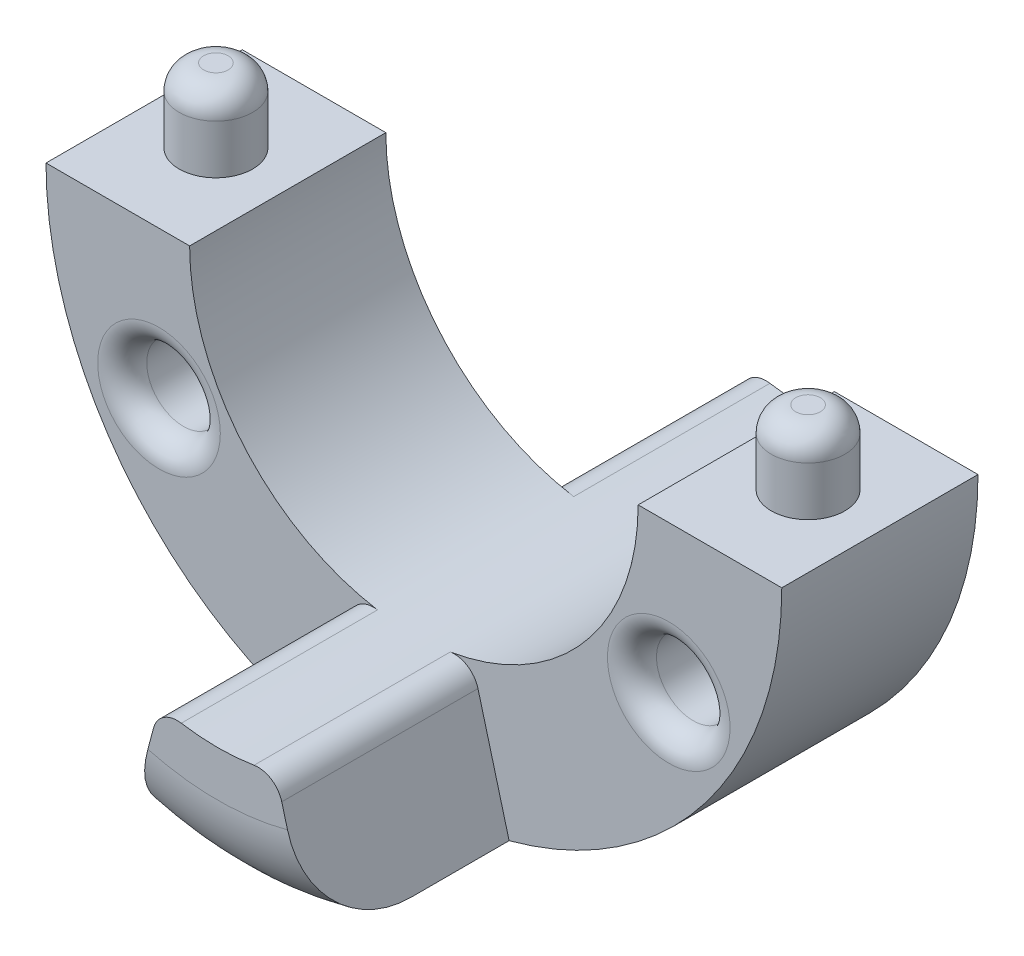
ISO-10303-21;
HEADER;
FILE_DESCRIPTION(('STEP AP214'),'2;1');
FILE_NAME('part.step','',(''),(''),'','','');
FILE_SCHEMA(('AUTOMOTIVE_DESIGN { 1 0 10303 214 1 1 1 1 }'));
ENDSEC;
DATA;
#1=APPLICATION_CONTEXT('core data for automotive mechanical design processes');
#2=APPLICATION_PROTOCOL_DEFINITION('international standard','automotive_design',2000,#1);
#3=PRODUCT_CONTEXT('',#1,'mechanical');
#4=PRODUCT('Part','Part','',(#3));
#5=PRODUCT_RELATED_PRODUCT_CATEGORY('part','',(#4));
#6=PRODUCT_DEFINITION_FORMATION('','',#4);
#7=PRODUCT_DEFINITION_CONTEXT('part definition',#1,'design');
#8=PRODUCT_DEFINITION('design','',#6,#7);
#9=PRODUCT_DEFINITION_SHAPE('','',#8);
#10=(LENGTH_UNIT() NAMED_UNIT(*) SI_UNIT(.MILLI.,.METRE.));
#11=(NAMED_UNIT(*) PLANE_ANGLE_UNIT() SI_UNIT($,.RADIAN.));
#12=(NAMED_UNIT(*) SI_UNIT($,.STERADIAN.) SOLID_ANGLE_UNIT());
#13=UNCERTAINTY_MEASURE_WITH_UNIT(LENGTH_MEASURE(1.E-05),#10,'distance_accuracy_value','');
#14=(GEOMETRIC_REPRESENTATION_CONTEXT(3) GLOBAL_UNCERTAINTY_ASSIGNED_CONTEXT((#13)) GLOBAL_UNIT_ASSIGNED_CONTEXT((#10,
#11,#12)) REPRESENTATION_CONTEXT('',''));
#15=CARTESIAN_POINT('',(0.,0.,0.));
#16=DIRECTION('',(0.,0.,1.));
#17=DIRECTION('',(1.,0.,0.));
#18=AXIS2_PLACEMENT_3D('',#15,#16,#17);
#19=CARTESIAN_POINT('',(-3.75,0.,-2.));
#20=DIRECTION('',(0.,-1.,0.));
#21=DIRECTION('',(1.,0.,0.));
#22=AXIS2_PLACEMENT_3D('',#19,#20,#21);
#23=PLANE('',#22);
#24=DIRECTION('',(1.,0.,0.));
#25=VECTOR('',#24,1.);
#26=CARTESIAN_POINT('',(0.,0.,2.));
#27=LINE('',#26,#25);
#28=CARTESIAN_POINT('',(2.286,0.,2.));
#29=VERTEX_POINT('',#28);
#30=CARTESIAN_POINT('',(3.75,0.,2.));
#31=VERTEX_POINT('',#30);
#32=EDGE_CURVE('E161',#29,#31,#27,.T.);
#33=ORIENTED_EDGE('',*,*,#32,.T.);
#34=DIRECTION('',(0.,0.,1.));
#35=VECTOR('',#34,1.);
#36=CARTESIAN_POINT('',(3.75,0.,-2.));
#37=LINE('',#36,#35);
#38=CARTESIAN_POINT('',(3.75,0.,0.));
#39=VERTEX_POINT('',#38);
#40=EDGE_CURVE('E158',#39,#31,#37,.T.);
#41=ORIENTED_EDGE('',*,*,#40,.F.);
#42=DIRECTION('',(1.,0.,0.));
#43=VECTOR('',#42,1.);
#44=CARTESIAN_POINT('',(0.,0.,0.));
#45=LINE('',#44,#43);
#46=CARTESIAN_POINT('',(2.286,0.,0.));
#47=VERTEX_POINT('',#46);
#48=EDGE_CURVE('E50',#47,#39,#45,.T.);
#49=ORIENTED_EDGE('',*,*,#48,.F.);
#50=DIRECTION('',(0.,0.,-1.));
#51=VECTOR('',#50,1.);
#52=CARTESIAN_POINT('',(2.286,0.,2.));
#53=LINE('',#52,#51);
#54=EDGE_CURVE('E272',#47,#29,#53,.F.);
#55=ORIENTED_EDGE('',*,*,#54,.T.);
#56=EDGE_LOOP('',(#33,#41,#49,#55));
#57=FACE_BOUND('',#56,.T.);
#58=CARTESIAN_POINT('',(3.018,0.,1.));
#59=DIRECTION('',(0.,-1.,0.));
#60=DIRECTION('',(1.,0.,0.));
#61=AXIS2_PLACEMENT_3D('',#58,#59,#60);
#62=CIRCLE('',#61,0.375);
#63=CARTESIAN_POINT('',(3.393,0.,1.));
#64=VERTEX_POINT('',#63);
#65=EDGE_CURVE('E279',#64,#64,#62,.F.);
#66=ORIENTED_EDGE('',*,*,#65,.F.);
#67=EDGE_LOOP('',(#66));
#68=FACE_BOUND('',#67,.T.);
#69=ADVANCED_FACE('F35',(#57,#68),#23,.F.);
#70=DIRECTION('',(1.,0.,0.));
#71=VECTOR('',#70,1.);
#72=CARTESIAN_POINT('',(0.,0.,2.));
#73=LINE('',#72,#71);
#74=CARTESIAN_POINT('',(-3.75,0.,2.));
#75=VERTEX_POINT('',#74);
#76=CARTESIAN_POINT('',(-2.286,0.,2.));
#77=VERTEX_POINT('',#76);
#78=EDGE_CURVE('E58',#75,#77,#73,.T.);
#79=ORIENTED_EDGE('',*,*,#78,.T.);
#80=DIRECTION('',(0.,0.,-1.));
#81=VECTOR('',#80,1.);
#82=CARTESIAN_POINT('',(-2.286,0.,2.));
#83=LINE('',#82,#81);
#84=CARTESIAN_POINT('',(-2.286,0.,0.));
#85=VERTEX_POINT('',#84);
#86=EDGE_CURVE('E274',#77,#85,#83,.T.);
#87=ORIENTED_EDGE('',*,*,#86,.T.);
#88=DIRECTION('',(1.,0.,0.));
#89=VECTOR('',#88,1.);
#90=CARTESIAN_POINT('',(0.,0.,0.));
#91=LINE('',#90,#89);
#92=CARTESIAN_POINT('',(-3.75,0.,0.));
#93=VERTEX_POINT('',#92);
#94=EDGE_CURVE('E420',#93,#85,#91,.T.);
#95=ORIENTED_EDGE('',*,*,#94,.F.);
#96=DIRECTION('',(0.,0.,1.));
#97=VECTOR('',#96,1.);
#98=CARTESIAN_POINT('',(-3.75,0.,-2.));
#99=LINE('',#98,#97);
#100=EDGE_CURVE('E166',#93,#75,#99,.T.);
#101=ORIENTED_EDGE('',*,*,#100,.T.);
#102=EDGE_LOOP('',(#79,#87,#95,#101));
#103=FACE_BOUND('',#102,.T.);
#104=CARTESIAN_POINT('',(-3.018,0.,1.));
#105=DIRECTION('',(0.,-1.,0.));
#106=DIRECTION('',(1.,0.,0.));
#107=AXIS2_PLACEMENT_3D('',#104,#105,#106);
#108=CIRCLE('',#107,0.375);
#109=CARTESIAN_POINT('',(-2.643,0.,1.));
#110=VERTEX_POINT('',#109);
#111=EDGE_CURVE('E276',#110,#110,#108,.F.);
#112=ORIENTED_EDGE('',*,*,#111,.F.);
#113=EDGE_LOOP('',(#112));
#114=FACE_BOUND('',#113,.T.);
#115=ADVANCED_FACE('F302',(#103,#114),#23,.F.);
#116=CARTESIAN_POINT('',(0.,0.,2.));
#117=DIRECTION('',(0.,0.,1.));
#118=DIRECTION('',(1.,0.,0.));
#119=AXIS2_PLACEMENT_3D('',#116,#117,#118);
#120=PLANE('',#119);
#121=ORIENTED_EDGE('',*,*,#32,.F.);
#122=CARTESIAN_POINT('',(0.,0.,2.));
#123=DIRECTION('',(0.,0.,1.));
#124=DIRECTION('',(1.,0.,0.));
#125=AXIS2_PLACEMENT_3D('',#122,#123,#124);
#126=CIRCLE('',#125,2.286);
#127=CARTESIAN_POINT('',(0.371102302170021,-2.25567707824593,2.));
#128=VERTEX_POINT('',#127);
#129=EDGE_CURVE('E188',#128,#29,#126,.T.);
#130=ORIENTED_EDGE('',*,*,#129,.F.);
#131=CARTESIAN_POINT('',(0.411686543439708,-2.50236092319846,2.));
#132=DIRECTION('',(0.,0.,1.));
#133=DIRECTION('',(1.,0.,0.));
#134=AXIS2_PLACEMENT_3D('',#131,#132,#133);
#135=CIRCLE('',#134,0.25);
#136=CARTESIAN_POINT('',(0.653168000011975,-2.43765616192283,2.));
#137=VERTEX_POINT('',#136);
#138=EDGE_CURVE('E267',#128,#137,#135,.F.);
#139=ORIENTED_EDGE('',*,*,#138,.T.);
#140=DIRECTION('',(-0.258819045102521,0.965925826289068,0.));
#141=VECTOR('',#140,1.);
#142=CARTESIAN_POINT('',(0.,0.,2.));
#143=LINE('',#142,#141);
#144=CARTESIAN_POINT('',(0.970571419134455,-3.62222184858401,2.));
#145=VERTEX_POINT('',#144);
#146=EDGE_CURVE('E410',#145,#137,#143,.T.);
#147=ORIENTED_EDGE('',*,*,#146,.F.);
#148=CARTESIAN_POINT('',(0.,0.,2.));
#149=DIRECTION('',(0.,0.,1.));
#150=DIRECTION('',(1.,0.,0.));
#151=AXIS2_PLACEMENT_3D('',#148,#149,#150);
#152=CIRCLE('',#151,3.75);
#153=EDGE_CURVE('E186',#145,#31,#152,.T.);
#154=ORIENTED_EDGE('',*,*,#153,.T.);
#155=EDGE_LOOP('',(#121,#130,#139,#147,#154));
#156=FACE_BOUND('',#155,.T.);
#157=CARTESIAN_POINT('',(2.59807621135332,-1.5,2.));
#158=DIRECTION('',(0.,0.,1.));
#159=DIRECTION('',(1.,0.,0.));
#160=AXIS2_PLACEMENT_3D('',#157,#158,#159);
#161=CIRCLE('',#160,0.625);
#162=CARTESIAN_POINT('',(3.22307621135332,-1.5,2.));
#163=VERTEX_POINT('',#162);
#164=EDGE_CURVE('E219',#163,#163,#161,.F.);
#165=ORIENTED_EDGE('',*,*,#164,.T.);
#166=EDGE_LOOP('',(#165));
#167=FACE_BOUND('',#166,.T.);
#168=ADVANCED_FACE('F308',(#156,#167),#120,.T.);
#169=CARTESIAN_POINT('',(0.,0.,0.));
#170=DIRECTION('',(0.,0.,1.));
#171=DIRECTION('',(1.,0.,0.));
#172=AXIS2_PLACEMENT_3D('',#169,#170,#171);
#173=PLANE('',#172);
#174=CARTESIAN_POINT('',(2.59807621135332,-1.5,0.));
#175=DIRECTION('',(0.,0.,1.));
#176=DIRECTION('',(1.,0.,0.));
#177=AXIS2_PLACEMENT_3D('',#174,#175,#176);
#178=CIRCLE('',#177,0.625);
#179=CARTESIAN_POINT('',(3.22307621135332,-1.5,0.));
#180=VERTEX_POINT('',#179);
#181=EDGE_CURVE('E210',#180,#180,#178,.T.);
#182=ORIENTED_EDGE('',*,*,#181,.T.);
#183=EDGE_LOOP('',(#182));
#184=FACE_BOUND('',#183,.T.);
#185=CARTESIAN_POINT('',(0.,0.,0.));
#186=DIRECTION('',(0.,0.,1.));
#187=DIRECTION('',(1.,0.,0.));
#188=AXIS2_PLACEMENT_3D('',#185,#186,#187);
#189=CIRCLE('',#188,2.286);
#190=CARTESIAN_POINT('',(0.371102302170021,-2.25567707824593,0.));
#191=VERTEX_POINT('',#190);
#192=EDGE_CURVE('E175',#191,#47,#189,.T.);
#193=ORIENTED_EDGE('',*,*,#192,.T.);
#194=ORIENTED_EDGE('',*,*,#48,.T.);
#195=CARTESIAN_POINT('',(0.,0.,0.));
#196=DIRECTION('',(0.,0.,1.));
#197=DIRECTION('',(1.,0.,0.));
#198=AXIS2_PLACEMENT_3D('',#195,#196,#197);
#199=CIRCLE('',#198,3.75);
#200=CARTESIAN_POINT('',(0.970571419134455,-3.62222184858401,0.));
#201=VERTEX_POINT('',#200);
#202=EDGE_CURVE('E173',#201,#39,#199,.T.);
#203=ORIENTED_EDGE('',*,*,#202,.F.);
#204=DIRECTION('',(-0.258819045102521,0.965925826289068,0.));
#205=VECTOR('',#204,1.);
#206=CARTESIAN_POINT('',(0.,0.,0.));
#207=LINE('',#206,#205);
#208=CARTESIAN_POINT('',(0.653168000011975,-2.43765616192283,0.));
#209=VERTEX_POINT('',#208);
#210=EDGE_CURVE('E448',#201,#209,#207,.T.);
#211=ORIENTED_EDGE('',*,*,#210,.T.);
#212=CARTESIAN_POINT('',(0.411686543439708,-2.50236092319846,0.));
#213=DIRECTION('',(0.,0.,1.));
#214=DIRECTION('',(1.,0.,0.));
#215=AXIS2_PLACEMENT_3D('',#212,#213,#214);
#216=CIRCLE('',#215,0.25);
#217=EDGE_CURVE('E263',#209,#191,#216,.T.);
#218=ORIENTED_EDGE('',*,*,#217,.T.);
#219=EDGE_LOOP('',(#193,#194,#203,#211,#218));
#220=FACE_BOUND('',#219,.T.);
#221=ADVANCED_FACE('F171',(#184,#220),#173,.F.);
#222=ORIENTED_EDGE('',*,*,#78,.F.);
#223=CARTESIAN_POINT('',(-0.970571419134455,-3.62222184858401,2.));
#224=VERTEX_POINT('',#223);
#225=EDGE_CURVE('E183',#75,#224,#152,.T.);
#226=ORIENTED_EDGE('',*,*,#225,.T.);
#227=DIRECTION('',(-0.258819045102521,-0.965925826289068,0.));
#228=VECTOR('',#227,1.);
#229=CARTESIAN_POINT('',(0.,0.,2.));
#230=LINE('',#229,#228);
#231=CARTESIAN_POINT('',(-0.653168000011975,-2.43765616192283,2.));
#232=VERTEX_POINT('',#231);
#233=EDGE_CURVE('E403',#232,#224,#230,.T.);
#234=ORIENTED_EDGE('',*,*,#233,.F.);
#235=CARTESIAN_POINT('',(-0.411686543439708,-2.50236092319846,2.));
#236=DIRECTION('',(0.,0.,1.));
#237=DIRECTION('',(1.,0.,0.));
#238=AXIS2_PLACEMENT_3D('',#235,#236,#237);
#239=CIRCLE('',#238,0.25);
#240=CARTESIAN_POINT('',(-0.37110230217002,-2.25567707824593,2.));
#241=VERTEX_POINT('',#240);
#242=EDGE_CURVE('E269',#232,#241,#239,.F.);
#243=ORIENTED_EDGE('',*,*,#242,.T.);
#244=EDGE_CURVE('E401',#77,#241,#126,.T.);
#245=ORIENTED_EDGE('',*,*,#244,.F.);
#246=EDGE_LOOP('',(#222,#226,#234,#243,#245));
#247=FACE_BOUND('',#246,.T.);
#248=CARTESIAN_POINT('',(-2.59807621135332,-1.5,2.));
#249=DIRECTION('',(0.,0.,1.));
#250=DIRECTION('',(1.,0.,0.));
#251=AXIS2_PLACEMENT_3D('',#248,#249,#250);
#252=CIRCLE('',#251,0.625);
#253=CARTESIAN_POINT('',(-1.97307621135332,-1.5,2.));
#254=VERTEX_POINT('',#253);
#255=EDGE_CURVE('E231',#254,#254,#252,.F.);
#256=ORIENTED_EDGE('',*,*,#255,.T.);
#257=EDGE_LOOP('',(#256));
#258=FACE_BOUND('',#257,.T.);
#259=ADVANCED_FACE('F344',(#247,#258),#120,.T.);
#260=CARTESIAN_POINT('',(-2.59807621135332,-1.5,0.));
#261=DIRECTION('',(0.,0.,1.));
#262=DIRECTION('',(1.,0.,0.));
#263=AXIS2_PLACEMENT_3D('',#260,#261,#262);
#264=CIRCLE('',#263,0.625);
#265=CARTESIAN_POINT('',(-1.97307621135332,-1.5,0.));
#266=VERTEX_POINT('',#265);
#267=EDGE_CURVE('E222',#266,#266,#264,.T.);
#268=ORIENTED_EDGE('',*,*,#267,.T.);
#269=EDGE_LOOP('',(#268));
#270=FACE_BOUND('',#269,.T.);
#271=CARTESIAN_POINT('',(-0.970571419134455,-3.62222184858401,0.));
#272=VERTEX_POINT('',#271);
#273=EDGE_CURVE('E184',#93,#272,#199,.T.);
#274=ORIENTED_EDGE('',*,*,#273,.F.);
#275=ORIENTED_EDGE('',*,*,#94,.T.);
#276=CARTESIAN_POINT('',(-0.37110230217002,-2.25567707824593,0.));
#277=VERTEX_POINT('',#276);
#278=EDGE_CURVE('E406',#85,#277,#189,.T.);
#279=ORIENTED_EDGE('',*,*,#278,.T.);
#280=CARTESIAN_POINT('',(-0.411686543439708,-2.50236092319846,0.));
#281=DIRECTION('',(0.,0.,1.));
#282=DIRECTION('',(1.,0.,0.));
#283=AXIS2_PLACEMENT_3D('',#280,#281,#282);
#284=CIRCLE('',#283,0.25);
#285=CARTESIAN_POINT('',(-0.653168000011975,-2.43765616192283,0.));
#286=VERTEX_POINT('',#285);
#287=EDGE_CURVE('E265',#277,#286,#284,.T.);
#288=ORIENTED_EDGE('',*,*,#287,.T.);
#289=DIRECTION('',(-0.258819045102521,-0.965925826289068,0.));
#290=VECTOR('',#289,1.);
#291=CARTESIAN_POINT('',(0.,0.,0.));
#292=LINE('',#291,#290);
#293=EDGE_CURVE('E407',#286,#272,#292,.T.);
#294=ORIENTED_EDGE('',*,*,#293,.T.);
#295=EDGE_LOOP('',(#274,#275,#279,#288,#294));
#296=FACE_BOUND('',#295,.T.);
#297=ADVANCED_FACE('F347',(#270,#296),#173,.F.);
#298=CARTESIAN_POINT('',(0.,0.,2.));
#299=DIRECTION('',(0.,0.,-1.));
#300=DIRECTION('',(-1.,0.,0.));
#301=AXIS2_PLACEMENT_3D('',#298,#299,#300);
#302=CYLINDRICAL_SURFACE('',#301,3.75);
#303=ORIENTED_EDGE('',*,*,#225,.F.);
#304=ORIENTED_EDGE('',*,*,#100,.F.);
#305=ORIENTED_EDGE('',*,*,#273,.T.);
#306=DIRECTION('',(0.,0.,1.));
#307=VECTOR('',#306,1.);
#308=CARTESIAN_POINT('',(-0.970571419134455,-3.62222184858401,-2.));
#309=LINE('',#308,#307);
#310=CARTESIAN_POINT('',(-0.970571419134455,-3.62222184858401,-1.));
#311=VERTEX_POINT('',#310);
#312=EDGE_CURVE('E445',#311,#272,#309,.T.);
#313=ORIENTED_EDGE('',*,*,#312,.F.);
#314=CARTESIAN_POINT('',(0.,0.,-1.));
#315=DIRECTION('',(0.,0.,1.));
#316=DIRECTION('',(1.,0.,0.));
#317=AXIS2_PLACEMENT_3D('',#314,#315,#316);
#318=CIRCLE('',#317,3.75);
#319=CARTESIAN_POINT('',(0.970571419134455,-3.62222184858401,-1.));
#320=VERTEX_POINT('',#319);
#321=EDGE_CURVE('E193',#311,#320,#318,.T.);
#322=ORIENTED_EDGE('',*,*,#321,.T.);
#323=DIRECTION('',(0.,0.,1.));
#324=VECTOR('',#323,1.);
#325=CARTESIAN_POINT('',(0.970571419134455,-3.62222184858401,-2.));
#326=LINE('',#325,#324);
#327=EDGE_CURVE('E181',#320,#201,#326,.T.);
#328=ORIENTED_EDGE('',*,*,#327,.T.);
#329=ORIENTED_EDGE('',*,*,#202,.T.);
#330=ORIENTED_EDGE('',*,*,#40,.T.);
#331=ORIENTED_EDGE('',*,*,#153,.F.);
#332=CARTESIAN_POINT('',(0.970571419134455,-3.62222184858401,3.));
#333=VERTEX_POINT('',#332);
#334=EDGE_CURVE('E444',#145,#333,#326,.T.);
#335=ORIENTED_EDGE('',*,*,#334,.T.);
#336=CARTESIAN_POINT('',(0.,0.,3.));
#337=DIRECTION('',(0.,0.,1.));
#338=DIRECTION('',(1.,0.,0.));
#339=AXIS2_PLACEMENT_3D('',#336,#337,#338);
#340=CIRCLE('',#339,3.75);
#341=CARTESIAN_POINT('',(-0.970571419134455,-3.62222184858401,3.));
#342=VERTEX_POINT('',#341);
#343=EDGE_CURVE('E191',#333,#342,#340,.F.);
#344=ORIENTED_EDGE('',*,*,#343,.T.);
#345=EDGE_CURVE('E449',#224,#342,#309,.T.);
#346=ORIENTED_EDGE('',*,*,#345,.F.);
#347=EDGE_LOOP('',(#303,#304,#305,#313,#322,#328,#329,#330,#331,#335,#344,#346));
#348=FACE_BOUND('',#347,.T.);
#349=ADVANCED_FACE('F178',(#348),#302,.T.);
#350=CARTESIAN_POINT('',(0.,0.,2.));
#351=DIRECTION('',(0.,0.,-1.));
#352=DIRECTION('',(-1.,0.,0.));
#353=AXIS2_PLACEMENT_3D('',#350,#351,#352);
#354=CYLINDRICAL_SURFACE('',#353,2.286);
#355=ORIENTED_EDGE('',*,*,#86,.F.);
#356=ORIENTED_EDGE('',*,*,#244,.T.);
#357=DIRECTION('',(0.,0.,-1.));
#358=VECTOR('',#357,1.);
#359=CARTESIAN_POINT('',(-0.37110230217002,-2.25567707824593,2.));
#360=LINE('',#359,#358);
#361=CARTESIAN_POINT('',(-0.37110230217002,-2.25567707824593,4.));
#362=VERTEX_POINT('',#361);
#363=EDGE_CURVE('E234',#241,#362,#360,.F.);
#364=ORIENTED_EDGE('',*,*,#363,.T.);
#365=CARTESIAN_POINT('',(0.,0.,4.));
#366=DIRECTION('',(0.,0.,-1.));
#367=DIRECTION('',(1.,0.,0.));
#368=AXIS2_PLACEMENT_3D('',#365,#366,#367);
#369=CIRCLE('',#368,2.286);
#370=CARTESIAN_POINT('',(0.371102302170021,-2.25567707824593,4.));
#371=VERTEX_POINT('',#370);
#372=EDGE_CURVE('E432',#371,#362,#369,.T.);
#373=ORIENTED_EDGE('',*,*,#372,.F.);
#374=DIRECTION('',(0.,0.,-1.));
#375=VECTOR('',#374,1.);
#376=CARTESIAN_POINT('',(0.371102302170021,-2.25567707824593,2.));
#377=LINE('',#376,#375);
#378=EDGE_CURVE('E237',#371,#128,#377,.T.);
#379=ORIENTED_EDGE('',*,*,#378,.T.);
#380=ORIENTED_EDGE('',*,*,#129,.T.);
#381=ORIENTED_EDGE('',*,*,#54,.F.);
#382=ORIENTED_EDGE('',*,*,#192,.F.);
#383=DIRECTION('',(0.,0.,-1.));
#384=VECTOR('',#383,1.);
#385=CARTESIAN_POINT('',(0.371102302170021,-2.25567707824593,2.));
#386=LINE('',#385,#384);
#387=CARTESIAN_POINT('',(0.371102302170021,-2.25567707824593,-2.));
#388=VERTEX_POINT('',#387);
#389=EDGE_CURVE('E243',#191,#388,#386,.T.);
#390=ORIENTED_EDGE('',*,*,#389,.T.);
#391=CARTESIAN_POINT('',(0.,0.,-2.));
#392=DIRECTION('',(0.,0.,-1.));
#393=DIRECTION('',(1.,0.,0.));
#394=AXIS2_PLACEMENT_3D('',#391,#392,#393);
#395=CIRCLE('',#394,2.286);
#396=CARTESIAN_POINT('',(-0.37110230217002,-2.25567707824593,-2.));
#397=VERTEX_POINT('',#396);
#398=EDGE_CURVE('E439',#388,#397,#395,.T.);
#399=ORIENTED_EDGE('',*,*,#398,.T.);
#400=DIRECTION('',(0.,0.,-1.));
#401=VECTOR('',#400,1.);
#402=CARTESIAN_POINT('',(-0.37110230217002,-2.25567707824593,2.));
#403=LINE('',#402,#401);
#404=EDGE_CURVE('E240',#397,#277,#403,.F.);
#405=ORIENTED_EDGE('',*,*,#404,.T.);
#406=ORIENTED_EDGE('',*,*,#278,.F.);
#407=EDGE_LOOP('',(#355,#356,#364,#373,#379,#380,#381,#382,#390,#399,#405,#406));
#408=FACE_BOUND('',#407,.T.);
#409=ADVANCED_FACE('F339',(#408),#354,.F.);
#410=CARTESIAN_POINT('',(2.59807621135332,-1.5,2.));
#411=DIRECTION('',(0.,0.,-1.));
#412=DIRECTION('',(-1.,0.,0.));
#413=AXIS2_PLACEMENT_3D('',#410,#411,#412);
#414=CYLINDRICAL_SURFACE('',#413,0.375);
#415=CARTESIAN_POINT('',(2.59807621135332,-1.5,0.25));
#416=DIRECTION('',(0.,0.,1.));
#417=DIRECTION('',(1.,0.,0.));
#418=AXIS2_PLACEMENT_3D('',#415,#416,#417);
#419=CIRCLE('',#418,0.375);
#420=CARTESIAN_POINT('',(2.97307621135332,-1.5,0.25));
#421=VERTEX_POINT('',#420);
#422=EDGE_CURVE('E216',#421,#421,#419,.F.);
#423=ORIENTED_EDGE('',*,*,#422,.T.);
#424=EDGE_LOOP('',(#423));
#425=FACE_BOUND('',#424,.T.);
#426=CARTESIAN_POINT('',(2.59807621135332,-1.5,1.75));
#427=DIRECTION('',(0.,0.,1.));
#428=DIRECTION('',(1.,0.,0.));
#429=AXIS2_PLACEMENT_3D('',#426,#427,#428);
#430=CIRCLE('',#429,0.375);
#431=CARTESIAN_POINT('',(2.97307621135332,-1.5,1.75));
#432=VERTEX_POINT('',#431);
#433=EDGE_CURVE('E213',#432,#432,#430,.T.);
#434=ORIENTED_EDGE('',*,*,#433,.T.);
#435=EDGE_LOOP('',(#434));
#436=FACE_BOUND('',#435,.T.);
#437=ADVANCED_FACE('F335',(#425,#436),#414,.F.);
#438=CARTESIAN_POINT('',(-2.59807621135332,-1.5,2.));
#439=DIRECTION('',(0.,0.,-1.));
#440=DIRECTION('',(-1.,0.,0.));
#441=AXIS2_PLACEMENT_3D('',#438,#439,#440);
#442=CYLINDRICAL_SURFACE('',#441,0.375);
#443=CARTESIAN_POINT('',(-2.59807621135332,-1.5,0.25));
#444=DIRECTION('',(0.,0.,1.));
#445=DIRECTION('',(1.,0.,0.));
#446=AXIS2_PLACEMENT_3D('',#443,#444,#445);
#447=CIRCLE('',#446,0.375);
#448=CARTESIAN_POINT('',(-2.22307621135332,-1.5,0.25));
#449=VERTEX_POINT('',#448);
#450=EDGE_CURVE('E228',#449,#449,#447,.F.);
#451=ORIENTED_EDGE('',*,*,#450,.T.);
#452=EDGE_LOOP('',(#451));
#453=FACE_BOUND('',#452,.T.);
#454=CARTESIAN_POINT('',(-2.59807621135332,-1.5,1.75));
#455=DIRECTION('',(0.,0.,1.));
#456=DIRECTION('',(1.,0.,0.));
#457=AXIS2_PLACEMENT_3D('',#454,#455,#456);
#458=CIRCLE('',#457,0.375);
#459=CARTESIAN_POINT('',(-2.22307621135332,-1.5,1.75));
#460=VERTEX_POINT('',#459);
#461=EDGE_CURVE('E225',#460,#460,#458,.T.);
#462=ORIENTED_EDGE('',*,*,#461,.T.);
#463=EDGE_LOOP('',(#462));
#464=FACE_BOUND('',#463,.T.);
#465=ADVANCED_FACE('F323',(#453,#464),#442,.F.);
#466=CARTESIAN_POINT('',(0.,0.,-2.));
#467=DIRECTION('',(0.,0.,1.));
#468=DIRECTION('',(1.,0.,0.));
#469=AXIS2_PLACEMENT_3D('',#466,#467,#468);
#470=PLANE('',#469);
#471=ORIENTED_EDGE('',*,*,#398,.F.);
#472=CARTESIAN_POINT('',(0.411686543439708,-2.50236092319846,-2.));
#473=DIRECTION('',(0.,0.,1.));
#474=DIRECTION('',(1.,0.,0.));
#475=AXIS2_PLACEMENT_3D('',#472,#473,#474);
#476=CIRCLE('',#475,0.25);
#477=CARTESIAN_POINT('',(0.653168000011975,-2.43765616192283,-2.));
#478=VERTEX_POINT('',#477);
#479=EDGE_CURVE('E250',#388,#478,#476,.F.);
#480=ORIENTED_EDGE('',*,*,#479,.T.);
#481=DIRECTION('',(-0.258819045102521,0.965925826289068,0.));
#482=VECTOR('',#481,1.);
#483=CARTESIAN_POINT('',(0.591660337104364,-2.20810643889681,-2.));
#484=LINE('',#483,#482);
#485=CARTESIAN_POINT('',(0.711752374031934,-2.65629602229494,-2.));
#486=VERTEX_POINT('',#485);
#487=EDGE_CURVE('E436',#486,#478,#484,.T.);
#488=ORIENTED_EDGE('',*,*,#487,.F.);
#489=CARTESIAN_POINT('',(0.,0.,-2.));
#490=DIRECTION('',(0.,0.,1.));
#491=DIRECTION('',(1.,0.,0.));
#492=AXIS2_PLACEMENT_3D('',#489,#490,#491);
#493=CIRCLE('',#492,2.75);
#494=CARTESIAN_POINT('',(-0.711752374031933,-2.65629602229494,-2.));
#495=VERTEX_POINT('',#494);
#496=EDGE_CURVE('E197',#486,#495,#493,.F.);
#497=ORIENTED_EDGE('',*,*,#496,.T.);
#498=DIRECTION('',(-0.258819045102521,-0.965925826289068,0.));
#499=VECTOR('',#498,1.);
#500=CARTESIAN_POINT('',(-0.591660337104364,-2.20810643889681,-2.));
#501=LINE('',#500,#499);
#502=CARTESIAN_POINT('',(-0.653168000011975,-2.43765616192283,-2.));
#503=VERTEX_POINT('',#502);
#504=EDGE_CURVE('E442',#503,#495,#501,.T.);
#505=ORIENTED_EDGE('',*,*,#504,.F.);
#506=CARTESIAN_POINT('',(-0.411686543439708,-2.50236092319846,-2.));
#507=DIRECTION('',(0.,0.,1.));
#508=DIRECTION('',(1.,0.,0.));
#509=AXIS2_PLACEMENT_3D('',#506,#507,#508);
#510=CIRCLE('',#509,0.25);
#511=EDGE_CURVE('E248',#503,#397,#510,.F.);
#512=ORIENTED_EDGE('',*,*,#511,.T.);
#513=EDGE_LOOP('',(#471,#480,#488,#497,#505,#512));
#514=FACE_BOUND('',#513,.T.);
#515=ADVANCED_FACE('F319',(#514),#470,.F.);
#516=CARTESIAN_POINT('',(0.591660337104364,-2.20810643889681,-2.));
#517=DIRECTION('',(0.965925826289068,0.258819045102521,0.));
#518=DIRECTION('',(-0.258819045102521,0.965925826289068,0.));
#519=AXIS2_PLACEMENT_3D('',#516,#517,#518);
#520=PLANE('',#519);
#521=ORIENTED_EDGE('',*,*,#487,.T.);
#522=DIRECTION('',(0.,0.,-1.));
#523=VECTOR('',#522,1.);
#524=CARTESIAN_POINT('',(0.653168000011975,-2.43765616192283,-2.));
#525=LINE('',#524,#523);
#526=EDGE_CURVE('E245',#478,#209,#525,.F.);
#527=ORIENTED_EDGE('',*,*,#526,.T.);
#528=ORIENTED_EDGE('',*,*,#210,.F.);
#529=ORIENTED_EDGE('',*,*,#327,.F.);
#530=CARTESIAN_POINT('',(0.711752374031934,-2.65629602229494,-1.));
#531=DIRECTION('',(0.965925826289068,0.258819045102521,0.));
#532=DIRECTION('',(-0.258819045102521,0.965925826289068,0.));
#533=AXIS2_PLACEMENT_3D('',#530,#531,#532);
#534=CIRCLE('',#533,1.);
#535=EDGE_CURVE('E195',#320,#486,#534,.T.);
#536=ORIENTED_EDGE('',*,*,#535,.T.);
#537=EDGE_LOOP('',(#521,#527,#528,#529,#536));
#538=FACE_BOUND('',#537,.T.);
#539=ADVANCED_FACE('F322',(#538),#520,.T.);
#540=CARTESIAN_POINT('',(-0.591660337104364,-2.20810643889681,-2.));
#541=DIRECTION('',(-0.965925826289068,0.258819045102521,0.));
#542=DIRECTION('',(-0.258819045102521,-0.965925826289068,0.));
#543=AXIS2_PLACEMENT_3D('',#540,#541,#542);
#544=PLANE('',#543);
#545=ORIENTED_EDGE('',*,*,#293,.F.);
#546=DIRECTION('',(0.,0.,-1.));
#547=VECTOR('',#546,1.);
#548=CARTESIAN_POINT('',(-0.653168000011975,-2.43765616192283,-2.));
#549=LINE('',#548,#547);
#550=EDGE_CURVE('E252',#286,#503,#549,.T.);
#551=ORIENTED_EDGE('',*,*,#550,.T.);
#552=ORIENTED_EDGE('',*,*,#504,.T.);
#553=CARTESIAN_POINT('',(-0.711752374031933,-2.65629602229494,-1.));
#554=DIRECTION('',(-0.965925826289068,0.258819045102521,0.));
#555=DIRECTION('',(-0.258819045102521,-0.965925826289068,0.));
#556=AXIS2_PLACEMENT_3D('',#553,#554,#555);
#557=CIRCLE('',#556,1.);
#558=EDGE_CURVE('E200',#495,#311,#557,.T.);
#559=ORIENTED_EDGE('',*,*,#558,.T.);
#560=ORIENTED_EDGE('',*,*,#312,.T.);
#561=EDGE_LOOP('',(#545,#551,#552,#559,#560));
#562=FACE_BOUND('',#561,.T.);
#563=ADVANCED_FACE('F328',(#562),#544,.T.);
#564=DIRECTION('',(-0.258819045102521,-0.965925826289068,0.));
#565=VECTOR('',#564,1.);
#566=CARTESIAN_POINT('',(-0.591660337104364,-2.20810643889681,4.));
#567=LINE('',#566,#565);
#568=CARTESIAN_POINT('',(-0.653168000011975,-2.43765616192283,4.));
#569=VERTEX_POINT('',#568);
#570=CARTESIAN_POINT('',(-0.711752374031933,-2.65629602229494,4.));
#571=VERTEX_POINT('',#570);
#572=EDGE_CURVE('E434',#569,#571,#567,.T.);
#573=ORIENTED_EDGE('',*,*,#572,.F.);
#574=DIRECTION('',(0.,0.,-1.));
#575=VECTOR('',#574,1.);
#576=CARTESIAN_POINT('',(-0.653168000011975,-2.43765616192283,-2.));
#577=LINE('',#576,#575);
#578=EDGE_CURVE('E261',#569,#232,#577,.T.);
#579=ORIENTED_EDGE('',*,*,#578,.T.);
#580=ORIENTED_EDGE('',*,*,#233,.T.);
#581=ORIENTED_EDGE('',*,*,#345,.T.);
#582=CARTESIAN_POINT('',(-0.711752374031933,-2.65629602229494,3.));
#583=DIRECTION('',(-0.965925826289068,0.258819045102521,0.));
#584=DIRECTION('',(-0.258819045102521,-0.965925826289068,0.));
#585=AXIS2_PLACEMENT_3D('',#582,#583,#584);
#586=CIRCLE('',#585,1.);
#587=EDGE_CURVE('E207',#342,#571,#586,.T.);
#588=ORIENTED_EDGE('',*,*,#587,.T.);
#589=EDGE_LOOP('',(#573,#579,#580,#581,#588));
#590=FACE_BOUND('',#589,.T.);
#591=ADVANCED_FACE('F325',(#590),#544,.T.);
#592=ORIENTED_EDGE('',*,*,#146,.T.);
#593=DIRECTION('',(0.,0.,-1.));
#594=VECTOR('',#593,1.);
#595=CARTESIAN_POINT('',(0.653168000011975,-2.43765616192283,-2.));
#596=LINE('',#595,#594);
#597=CARTESIAN_POINT('',(0.653168000011975,-2.43765616192283,4.));
#598=VERTEX_POINT('',#597);
#599=EDGE_CURVE('E254',#137,#598,#596,.F.);
#600=ORIENTED_EDGE('',*,*,#599,.T.);
#601=DIRECTION('',(-0.258819045102521,0.965925826289068,0.));
#602=VECTOR('',#601,1.);
#603=CARTESIAN_POINT('',(0.591660337104364,-2.20810643889681,4.));
#604=LINE('',#603,#602);
#605=CARTESIAN_POINT('',(0.711752374031934,-2.65629602229494,4.));
#606=VERTEX_POINT('',#605);
#607=EDGE_CURVE('E426',#606,#598,#604,.T.);
#608=ORIENTED_EDGE('',*,*,#607,.F.);
#609=CARTESIAN_POINT('',(0.711752374031934,-2.65629602229494,3.));
#610=DIRECTION('',(0.965925826289068,0.258819045102521,0.));
#611=DIRECTION('',(-0.258819045102521,0.965925826289068,0.));
#612=AXIS2_PLACEMENT_3D('',#609,#610,#611);
#613=CIRCLE('',#612,1.);
#614=EDGE_CURVE('E205',#606,#333,#613,.T.);
#615=ORIENTED_EDGE('',*,*,#614,.T.);
#616=ORIENTED_EDGE('',*,*,#334,.F.);
#617=EDGE_LOOP('',(#592,#600,#608,#615,#616));
#618=FACE_BOUND('',#617,.T.);
#619=ADVANCED_FACE('F317',(#618),#520,.T.);
#620=CARTESIAN_POINT('',(0.,0.,4.));
#621=DIRECTION('',(0.,0.,1.));
#622=DIRECTION('',(1.,0.,0.));
#623=AXIS2_PLACEMENT_3D('',#620,#621,#622);
#624=PLANE('',#623);
#625=ORIENTED_EDGE('',*,*,#607,.T.);
#626=CARTESIAN_POINT('',(0.411686543439708,-2.50236092319846,4.));
#627=DIRECTION('',(0.,0.,1.));
#628=DIRECTION('',(1.,0.,0.));
#629=AXIS2_PLACEMENT_3D('',#626,#627,#628);
#630=CIRCLE('',#629,0.25);
#631=EDGE_CURVE('E259',#598,#371,#630,.T.);
#632=ORIENTED_EDGE('',*,*,#631,.T.);
#633=ORIENTED_EDGE('',*,*,#372,.T.);
#634=CARTESIAN_POINT('',(-0.411686543439708,-2.50236092319846,4.));
#635=DIRECTION('',(0.,0.,1.));
#636=DIRECTION('',(1.,0.,0.));
#637=AXIS2_PLACEMENT_3D('',#634,#635,#636);
#638=CIRCLE('',#637,0.25);
#639=EDGE_CURVE('E257',#362,#569,#638,.T.);
#640=ORIENTED_EDGE('',*,*,#639,.T.);
#641=ORIENTED_EDGE('',*,*,#572,.T.);
#642=CARTESIAN_POINT('',(0.,0.,4.));
#643=DIRECTION('',(0.,0.,1.));
#644=DIRECTION('',(1.,0.,0.));
#645=AXIS2_PLACEMENT_3D('',#642,#643,#644);
#646=CIRCLE('',#645,2.75);
#647=EDGE_CURVE('E202',#571,#606,#646,.T.);
#648=ORIENTED_EDGE('',*,*,#647,.T.);
#649=EDGE_LOOP('',(#625,#632,#633,#640,#641,#648));
#650=FACE_BOUND('',#649,.T.);
#651=ADVANCED_FACE('F313',(#650),#624,.T.);
#652=CARTESIAN_POINT('',(0.,0.,-1.));
#653=DIRECTION('',(0.,0.,1.));
#654=DIRECTION('',(1.,0.,0.));
#655=AXIS2_PLACEMENT_3D('',#652,#653,#654);
#656=TOROIDAL_SURFACE('',#655,2.75,1.);
#657=ORIENTED_EDGE('',*,*,#558,.F.);
#658=ORIENTED_EDGE('',*,*,#496,.F.);
#659=ORIENTED_EDGE('',*,*,#535,.F.);
#660=ORIENTED_EDGE('',*,*,#321,.F.);
#661=EDGE_LOOP('',(#657,#658,#659,#660));
#662=FACE_BOUND('',#661,.T.);
#663=ADVANCED_FACE('F316',(#662),#656,.T.);
#664=CARTESIAN_POINT('',(0.,0.,3.));
#665=DIRECTION('',(0.,0.,1.));
#666=DIRECTION('',(1.,0.,0.));
#667=AXIS2_PLACEMENT_3D('',#664,#665,#666);
#668=TOROIDAL_SURFACE('',#667,2.75,1.);
#669=ORIENTED_EDGE('',*,*,#587,.F.);
#670=ORIENTED_EDGE('',*,*,#343,.F.);
#671=ORIENTED_EDGE('',*,*,#614,.F.);
#672=ORIENTED_EDGE('',*,*,#647,.F.);
#673=EDGE_LOOP('',(#669,#670,#671,#672));
#674=FACE_BOUND('',#673,.T.);
#675=ADVANCED_FACE('F356',(#674),#668,.T.);
#676=CARTESIAN_POINT('',(2.59807621135332,-1.5,0.25));
#677=DIRECTION('',(0.,0.,1.));
#678=DIRECTION('',(1.,0.,0.));
#679=AXIS2_PLACEMENT_3D('',#676,#677,#678);
#680=TOROIDAL_SURFACE('',#679,0.625,0.25);
#681=ORIENTED_EDGE('',*,*,#422,.F.);
#682=EDGE_LOOP('',(#681));
#683=FACE_BOUND('',#682,.T.);
#684=ORIENTED_EDGE('',*,*,#181,.F.);
#685=EDGE_LOOP('',(#684));
#686=FACE_BOUND('',#685,.T.);
#687=ADVANCED_FACE('F360',(#683,#686),#680,.T.);
#688=CARTESIAN_POINT('',(2.59807621135332,-1.5,1.75));
#689=DIRECTION('',(0.,0.,1.));
#690=DIRECTION('',(1.,0.,0.));
#691=AXIS2_PLACEMENT_3D('',#688,#689,#690);
#692=TOROIDAL_SURFACE('',#691,0.625,0.25);
#693=ORIENTED_EDGE('',*,*,#164,.F.);
#694=EDGE_LOOP('',(#693));
#695=FACE_BOUND('',#694,.T.);
#696=ORIENTED_EDGE('',*,*,#433,.F.);
#697=EDGE_LOOP('',(#696));
#698=FACE_BOUND('',#697,.T.);
#699=ADVANCED_FACE('F364',(#695,#698),#692,.T.);
#700=CARTESIAN_POINT('',(-2.59807621135332,-1.5,0.25));
#701=DIRECTION('',(0.,0.,1.));
#702=DIRECTION('',(1.,0.,0.));
#703=AXIS2_PLACEMENT_3D('',#700,#701,#702);
#704=TOROIDAL_SURFACE('',#703,0.625,0.25);
#705=ORIENTED_EDGE('',*,*,#450,.F.);
#706=EDGE_LOOP('',(#705));
#707=FACE_BOUND('',#706,.T.);
#708=ORIENTED_EDGE('',*,*,#267,.F.);
#709=EDGE_LOOP('',(#708));
#710=FACE_BOUND('',#709,.T.);
#711=ADVANCED_FACE('F368',(#707,#710),#704,.T.);
#712=CARTESIAN_POINT('',(-2.59807621135332,-1.5,1.75));
#713=DIRECTION('',(0.,0.,1.));
#714=DIRECTION('',(1.,0.,0.));
#715=AXIS2_PLACEMENT_3D('',#712,#713,#714);
#716=TOROIDAL_SURFACE('',#715,0.625,0.25);
#717=ORIENTED_EDGE('',*,*,#255,.F.);
#718=EDGE_LOOP('',(#717));
#719=FACE_BOUND('',#718,.T.);
#720=ORIENTED_EDGE('',*,*,#461,.F.);
#721=EDGE_LOOP('',(#720));
#722=FACE_BOUND('',#721,.T.);
#723=ADVANCED_FACE('F372',(#719,#722),#716,.T.);
#724=CARTESIAN_POINT('',(0.411686543439708,-2.50236092319846,2.));
#725=DIRECTION('',(0.,0.,-1.));
#726=DIRECTION('',(-1.,0.,0.));
#727=AXIS2_PLACEMENT_3D('',#724,#725,#726);
#728=CYLINDRICAL_SURFACE('',#727,0.25);
#729=ORIENTED_EDGE('',*,*,#479,.F.);
#730=ORIENTED_EDGE('',*,*,#389,.F.);
#731=ORIENTED_EDGE('',*,*,#217,.F.);
#732=ORIENTED_EDGE('',*,*,#526,.F.);
#733=EDGE_LOOP('',(#729,#730,#731,#732));
#734=FACE_BOUND('',#733,.T.);
#735=ADVANCED_FACE('F376',(#734),#728,.T.);
#736=CARTESIAN_POINT('',(-0.411686543439708,-2.50236092319846,2.));
#737=DIRECTION('',(0.,0.,-1.));
#738=DIRECTION('',(-1.,0.,0.));
#739=AXIS2_PLACEMENT_3D('',#736,#737,#738);
#740=CYLINDRICAL_SURFACE('',#739,0.25);
#741=ORIENTED_EDGE('',*,*,#511,.F.);
#742=ORIENTED_EDGE('',*,*,#550,.F.);
#743=ORIENTED_EDGE('',*,*,#287,.F.);
#744=ORIENTED_EDGE('',*,*,#404,.F.);
#745=EDGE_LOOP('',(#741,#742,#743,#744));
#746=FACE_BOUND('',#745,.T.);
#747=ADVANCED_FACE('F380',(#746),#740,.T.);
#748=CARTESIAN_POINT('',(0.411686543439708,-2.50236092319846,2.));
#749=DIRECTION('',(0.,0.,-1.));
#750=DIRECTION('',(-1.,0.,0.));
#751=AXIS2_PLACEMENT_3D('',#748,#749,#750);
#752=CYLINDRICAL_SURFACE('',#751,0.25);
#753=ORIENTED_EDGE('',*,*,#138,.F.);
#754=ORIENTED_EDGE('',*,*,#378,.F.);
#755=ORIENTED_EDGE('',*,*,#631,.F.);
#756=ORIENTED_EDGE('',*,*,#599,.F.);
#757=EDGE_LOOP('',(#753,#754,#755,#756));
#758=FACE_BOUND('',#757,.T.);
#759=ADVANCED_FACE('F384',(#758),#752,.T.);
#760=CARTESIAN_POINT('',(-0.411686543439708,-2.50236092319846,2.));
#761=DIRECTION('',(0.,0.,-1.));
#762=DIRECTION('',(-1.,0.,0.));
#763=AXIS2_PLACEMENT_3D('',#760,#761,#762);
#764=CYLINDRICAL_SURFACE('',#763,0.25);
#765=ORIENTED_EDGE('',*,*,#242,.F.);
#766=ORIENTED_EDGE('',*,*,#578,.F.);
#767=ORIENTED_EDGE('',*,*,#639,.F.);
#768=ORIENTED_EDGE('',*,*,#363,.F.);
#769=EDGE_LOOP('',(#765,#766,#767,#768));
#770=FACE_BOUND('',#769,.T.);
#771=ADVANCED_FACE('F388',(#770),#764,.T.);
#772=CARTESIAN_POINT('',(-3.018,0.749999999999989,1.));
#773=DIRECTION('',(0.,-1.,0.));
#774=DIRECTION('',(1.,0.,0.));
#775=AXIS2_PLACEMENT_3D('',#772,#773,#774);
#776=CYLINDRICAL_SURFACE('',#775,0.375);
#777=CARTESIAN_POINT('',(-3.018,0.49999999999999,1.));
#778=DIRECTION('',(0.,1.,0.));
#779=DIRECTION('',(-1.,0.,0.));
#780=AXIS2_PLACEMENT_3D('',#777,#778,#779);
#781=CIRCLE('',#780,0.375);
#782=CARTESIAN_POINT('',(-3.393,0.499999999999988,1.));
#783=VERTEX_POINT('',#782);
#784=EDGE_CURVE('E11',#783,#783,#781,.F.);
#785=ORIENTED_EDGE('',*,*,#784,.T.);
#786=EDGE_LOOP('',(#785));
#787=FACE_BOUND('',#786,.T.);
#788=ORIENTED_EDGE('',*,*,#111,.T.);
#789=EDGE_LOOP('',(#788));
#790=FACE_BOUND('',#789,.T.);
#791=ADVANCED_FACE('F311',(#787,#790),#776,.T.);
#792=CARTESIAN_POINT('',(-3.018,0.749999999999989,1.));
#793=DIRECTION('',(0.,1.,0.));
#794=DIRECTION('',(-1.,0.,0.));
#795=AXIS2_PLACEMENT_3D('',#792,#793,#794);
#796=PLANE('',#795);
#797=CARTESIAN_POINT('',(-3.018,0.749999999999989,1.));
#798=DIRECTION('',(0.,1.,0.));
#799=DIRECTION('',(-1.,0.,0.));
#800=AXIS2_PLACEMENT_3D('',#797,#798,#799);
#801=CIRCLE('',#800,0.125);
#802=CARTESIAN_POINT('',(-3.143,0.749999999999989,1.));
#803=VERTEX_POINT('',#802);
#804=EDGE_CURVE('E43',#803,#803,#801,.T.);
#805=ORIENTED_EDGE('',*,*,#804,.T.);
#806=EDGE_LOOP('',(#805));
#807=FACE_BOUND('',#806,.T.);
#808=ADVANCED_FACE('F290',(#807),#796,.T.);
#809=CARTESIAN_POINT('',(3.018,0.750000000000011,1.));
#810=DIRECTION('',(0.,-1.,0.));
#811=DIRECTION('',(1.,0.,0.));
#812=AXIS2_PLACEMENT_3D('',#809,#810,#811);
#813=CYLINDRICAL_SURFACE('',#812,0.375);
#814=CARTESIAN_POINT('',(3.018,0.500000000000011,1.));
#815=DIRECTION('',(0.,-1.,0.));
#816=DIRECTION('',(1.,0.,0.));
#817=AXIS2_PLACEMENT_3D('',#814,#815,#816);
#818=CIRCLE('',#817,0.375);
#819=CARTESIAN_POINT('',(3.393,0.500000000000012,1.));
#820=VERTEX_POINT('',#819);
#821=EDGE_CURVE('E285',#820,#820,#818,.T.);
#822=ORIENTED_EDGE('',*,*,#821,.T.);
#823=EDGE_LOOP('',(#822));
#824=FACE_BOUND('',#823,.T.);
#825=ORIENTED_EDGE('',*,*,#65,.T.);
#826=EDGE_LOOP('',(#825));
#827=FACE_BOUND('',#826,.T.);
#828=ADVANCED_FACE('F594',(#824,#827),#813,.T.);
#829=CARTESIAN_POINT('',(3.018,0.750000000000011,1.));
#830=DIRECTION('',(0.,-1.,0.));
#831=DIRECTION('',(1.,0.,0.));
#832=AXIS2_PLACEMENT_3D('',#829,#830,#831);
#833=PLANE('',#832);
#834=CARTESIAN_POINT('',(3.018,0.750000000000011,1.));
#835=DIRECTION('',(0.,-1.,0.));
#836=DIRECTION('',(1.,0.,0.));
#837=AXIS2_PLACEMENT_3D('',#834,#835,#836);
#838=CIRCLE('',#837,0.125);
#839=CARTESIAN_POINT('',(3.143,0.750000000000011,1.));
#840=VERTEX_POINT('',#839);
#841=EDGE_CURVE('E282',#840,#840,#838,.F.);
#842=ORIENTED_EDGE('',*,*,#841,.T.);
#843=EDGE_LOOP('',(#842));
#844=FACE_BOUND('',#843,.T.);
#845=ADVANCED_FACE('F298',(#844),#833,.F.);
#846=CARTESIAN_POINT('',(3.018,0.500000000000011,1.));
#847=DIRECTION('',(0.,-1.,0.));
#848=DIRECTION('',(1.,0.,0.));
#849=AXIS2_PLACEMENT_3D('',#846,#847,#848);
#850=DEGENERATE_TOROIDAL_SURFACE('',#849,0.125,0.25,.T.);
#851=ORIENTED_EDGE('',*,*,#821,.F.);
#852=EDGE_LOOP('',(#851));
#853=FACE_BOUND('',#852,.T.);
#854=ORIENTED_EDGE('',*,*,#841,.F.);
#855=EDGE_LOOP('',(#854));
#856=FACE_BOUND('',#855,.T.);
#857=ADVANCED_FACE('F293',(#853,#856),#850,.T.);
#858=CARTESIAN_POINT('',(-3.018,0.49999999999999,1.));
#859=DIRECTION('',(0.,1.,0.));
#860=DIRECTION('',(-1.,0.,0.));
#861=AXIS2_PLACEMENT_3D('',#858,#859,#860);
#862=DEGENERATE_TOROIDAL_SURFACE('',#861,0.125,0.25,.T.);
#863=ORIENTED_EDGE('',*,*,#784,.F.);
#864=EDGE_LOOP('',(#863));
#865=FACE_BOUND('',#864,.T.);
#866=ORIENTED_EDGE('',*,*,#804,.F.);
#867=EDGE_LOOP('',(#866));
#868=FACE_BOUND('',#867,.T.);
#869=ADVANCED_FACE('F37',(#865,#868),#862,.T.);
#870=CLOSED_SHELL('',(#69,#115,#168,#221,#259,#297,#349,#409,#437,#465,#515,#539,#563,#591,#619,
#651,#663,#675,#687,#699,#711,#723,#735,#747,#759,#771,#791,#808,#828,#845,#857,#869));
#871=MANIFOLD_SOLID_BREP('B2',#870);
#872=ADVANCED_BREP_SHAPE_REPRESENTATION('',(#18,#871),#14);
#873=SHAPE_DEFINITION_REPRESENTATION(#9,#872);
ENDSEC;
END-ISO-10303-21;
